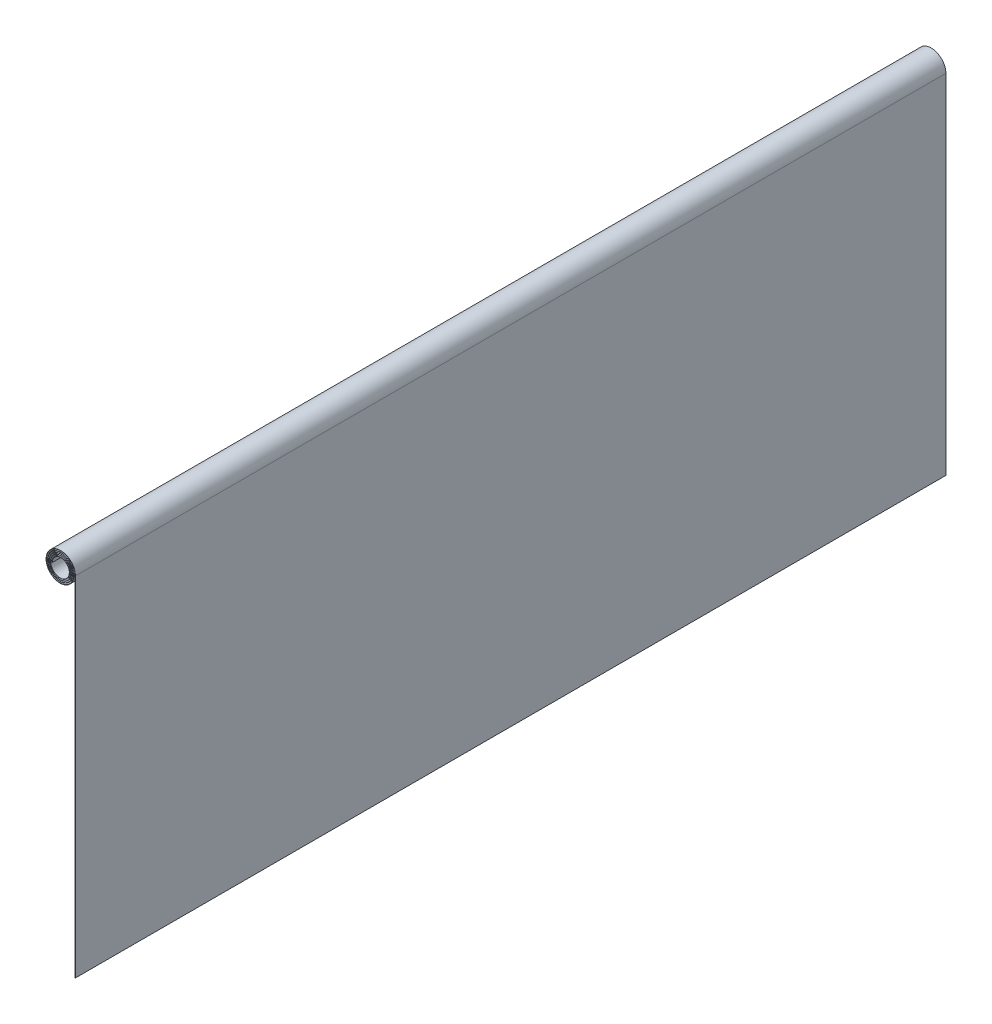
ISO-10303-21;
HEADER;
FILE_DESCRIPTION(('STEP AP214'),'2;1');
FILE_NAME('part.step','',(''),(''),'','','');
FILE_SCHEMA(('AUTOMOTIVE_DESIGN { 1 0 10303 214 1 1 1 1 }'));
ENDSEC;
DATA;
#1=APPLICATION_CONTEXT('core data for automotive mechanical design processes');
#2=APPLICATION_PROTOCOL_DEFINITION('international standard','automotive_design',2000,#1);
#3=PRODUCT_CONTEXT('',#1,'mechanical');
#4=PRODUCT('Part','Part','',(#3));
#5=PRODUCT_RELATED_PRODUCT_CATEGORY('part','',(#4));
#6=PRODUCT_DEFINITION_FORMATION('','',#4);
#7=PRODUCT_DEFINITION_CONTEXT('part definition',#1,'design');
#8=PRODUCT_DEFINITION('design','',#6,#7);
#9=PRODUCT_DEFINITION_SHAPE('','',#8);
#10=(LENGTH_UNIT() NAMED_UNIT(*) SI_UNIT(.MILLI.,.METRE.));
#11=(NAMED_UNIT(*) PLANE_ANGLE_UNIT() SI_UNIT($,.RADIAN.));
#12=(NAMED_UNIT(*) SI_UNIT($,.STERADIAN.) SOLID_ANGLE_UNIT());
#13=UNCERTAINTY_MEASURE_WITH_UNIT(LENGTH_MEASURE(1.E-05),#10,'distance_accuracy_value','');
#14=(GEOMETRIC_REPRESENTATION_CONTEXT(3) GLOBAL_UNCERTAINTY_ASSIGNED_CONTEXT((#13)) GLOBAL_UNIT_ASSIGNED_CONTEXT((#10,
#11,#12)) REPRESENTATION_CONTEXT('',''));
#15=CARTESIAN_POINT('',(0.,0.,0.));
#16=DIRECTION('',(0.,0.,1.));
#17=DIRECTION('',(1.,0.,0.));
#18=AXIS2_PLACEMENT_3D('',#15,#16,#17);
#19=CARTESIAN_POINT('',(0.,0.,0.));
#20=DIRECTION('',(0.,0.,1.));
#21=DIRECTION('',(1.,0.,0.));
#22=AXIS2_PLACEMENT_3D('',#19,#20,#21);
#23=CYLINDRICAL_SURFACE('',#22,14.7499999999999);
#24=DIRECTION('',(0.,0.,1.));
#25=VECTOR('',#24,1.);
#26=CARTESIAN_POINT('',(14.7500000000001,1.06661353137454E-12,749.999999999997));
#27=LINE('',#26,#25);
#28=CARTESIAN_POINT('',(14.7499999999998,1.06661353137453E-12,-750.000000000003));
#29=VERTEX_POINT('',#28);
#30=CARTESIAN_POINT('',(14.7500000000001,1.06661353137454E-12,749.999999999997));
#31=VERTEX_POINT('',#30);
#32=EDGE_CURVE('E337',#29,#31,#27,.T.);
#33=ORIENTED_EDGE('',*,*,#32,.T.);
#34=CARTESIAN_POINT('',(0.,0.,749.999999999997));
#35=DIRECTION('',(0.,0.,1.));
#36=DIRECTION('',(1.,0.,0.));
#37=AXIS2_PLACEMENT_3D('',#34,#35,#36);
#38=CIRCLE('',#37,14.7500000000001);
#39=CARTESIAN_POINT('',(-14.7500000000001,-1.0648071773458E-12,749.999999999997));
#40=VERTEX_POINT('',#39);
#41=EDGE_CURVE('E362',#31,#40,#38,.T.);
#42=ORIENTED_EDGE('',*,*,#41,.T.);
#43=DIRECTION('',(0.,0.,1.));
#44=VECTOR('',#43,1.);
#45=CARTESIAN_POINT('',(-14.7500000000001,-1.0648071773458E-12,749.999999999997));
#46=LINE('',#45,#44);
#47=CARTESIAN_POINT('',(-14.7499999999998,-1.06480717734578E-12,-750.000000000003));
#48=VERTEX_POINT('',#47);
#49=EDGE_CURVE('E57',#48,#40,#46,.T.);
#50=ORIENTED_EDGE('',*,*,#49,.F.);
#51=CARTESIAN_POINT('',(0.,0.,-750.000000000003));
#52=DIRECTION('',(0.,0.,1.));
#53=DIRECTION('',(1.,0.,0.));
#54=AXIS2_PLACEMENT_3D('',#51,#52,#53);
#55=CIRCLE('',#54,14.7499999999998);
#56=EDGE_CURVE('E42',#29,#48,#55,.T.);
#57=ORIENTED_EDGE('',*,*,#56,.F.);
#58=EDGE_LOOP('',(#33,#42,#50,#57));
#59=FACE_BOUND('',#58,.T.);
#60=ADVANCED_FACE('F35',(#59),#23,.F.);
#61=CARTESIAN_POINT('',(0.,0.,0.));
#62=DIRECTION('',(0.,0.,1.));
#63=DIRECTION('',(1.,0.,0.));
#64=AXIS2_PLACEMENT_3D('',#61,#62,#63);
#65=CYLINDRICAL_SURFACE('',#64,15.2499999999999);
#66=DIRECTION('',(0.,0.,-1.));
#67=VECTOR('',#66,1.);
#68=CARTESIAN_POINT('',(15.2500000000001,1.09454538208529E-12,749.999999999997));
#69=LINE('',#68,#67);
#70=CARTESIAN_POINT('',(15.2500000000001,1.09454538208529E-12,749.999999999997));
#71=VERTEX_POINT('',#70);
#72=CARTESIAN_POINT('',(15.2499999999998,1.09454538208527E-12,-750.000000000003));
#73=VERTEX_POINT('',#72);
#74=EDGE_CURVE('E334',#71,#73,#69,.T.);
#75=ORIENTED_EDGE('',*,*,#74,.T.);
#76=CARTESIAN_POINT('',(0.,0.,-750.000000000003));
#77=DIRECTION('',(0.,0.,1.));
#78=DIRECTION('',(1.,0.,0.));
#79=AXIS2_PLACEMENT_3D('',#76,#77,#78);
#80=CIRCLE('',#79,15.2499999999998);
#81=CARTESIAN_POINT('',(-15.2499999999998,-1.09267779571657E-12,-750.000000000003));
#82=VERTEX_POINT('',#81);
#83=EDGE_CURVE('E11',#73,#82,#80,.T.);
#84=ORIENTED_EDGE('',*,*,#83,.T.);
#85=DIRECTION('',(0.,0.,-1.));
#86=VECTOR('',#85,1.);
#87=CARTESIAN_POINT('',(-15.2500000000001,-1.09267779571659E-12,749.999999999997));
#88=LINE('',#87,#86);
#89=CARTESIAN_POINT('',(-15.2500000000001,-1.09267779571659E-12,749.999999999997));
#90=VERTEX_POINT('',#89);
#91=EDGE_CURVE('E352',#90,#82,#88,.T.);
#92=ORIENTED_EDGE('',*,*,#91,.F.);
#93=CARTESIAN_POINT('',(0.,0.,749.999999999997));
#94=DIRECTION('',(0.,0.,1.));
#95=DIRECTION('',(1.,0.,0.));
#96=AXIS2_PLACEMENT_3D('',#93,#94,#95);
#97=CIRCLE('',#96,15.2500000000001);
#98=EDGE_CURVE('E359',#71,#90,#97,.T.);
#99=ORIENTED_EDGE('',*,*,#98,.F.);
#100=EDGE_LOOP('',(#75,#84,#92,#99));
#101=FACE_BOUND('',#100,.T.);
#102=ADVANCED_FACE('F372',(#101),#65,.T.);
#103=CARTESIAN_POINT('',(-1.25,0.,0.));
#104=DIRECTION('',(0.,0.,1.));
#105=DIRECTION('',(1.,0.,0.));
#106=AXIS2_PLACEMENT_3D('',#103,#104,#105);
#107=CYLINDRICAL_SURFACE('',#106,15.9999999999999);
#108=DIRECTION('',(0.,0.,1.));
#109=VECTOR('',#108,1.);
#110=CARTESIAN_POINT('',(-17.2500000000001,-8.41199290809946E-13,749.999999999997));
#111=LINE('',#110,#109);
#112=CARTESIAN_POINT('',(-17.2499999999998,-8.41199290809934E-13,-750.000000000003));
#113=VERTEX_POINT('',#112);
#114=CARTESIAN_POINT('',(-17.2500000000001,-8.41199290809946E-13,749.999999999997));
#115=VERTEX_POINT('',#114);
#116=EDGE_CURVE('E319',#113,#115,#111,.T.);
#117=ORIENTED_EDGE('',*,*,#116,.T.);
#118=CARTESIAN_POINT('',(-1.25,0.,749.999999999997));
#119=DIRECTION('',(0.,0.,1.));
#120=DIRECTION('',(1.,0.,0.));
#121=AXIS2_PLACEMENT_3D('',#118,#119,#120);
#122=CIRCLE('',#121,16.0000000000001);
#123=EDGE_CURVE('E343',#115,#31,#122,.T.);
#124=ORIENTED_EDGE('',*,*,#123,.T.);
#125=ORIENTED_EDGE('',*,*,#32,.F.);
#126=CARTESIAN_POINT('',(-1.25,0.,-750.000000000003));
#127=DIRECTION('',(0.,0.,1.));
#128=DIRECTION('',(1.,0.,0.));
#129=AXIS2_PLACEMENT_3D('',#126,#127,#128);
#130=CIRCLE('',#129,15.9999999999998);
#131=EDGE_CURVE('E346',#113,#29,#130,.T.);
#132=ORIENTED_EDGE('',*,*,#131,.F.);
#133=EDGE_LOOP('',(#117,#124,#125,#132));
#134=FACE_BOUND('',#133,.T.);
#135=ADVANCED_FACE('F365',(#134),#107,.F.);
#136=CARTESIAN_POINT('',(-1.25,0.,0.));
#137=DIRECTION('',(0.,0.,1.));
#138=DIRECTION('',(1.,0.,0.));
#139=AXIS2_PLACEMENT_3D('',#136,#137,#138);
#140=CYLINDRICAL_SURFACE('',#139,16.4999999999999);
#141=DIRECTION('',(0.,0.,-1.));
#142=VECTOR('',#141,1.);
#143=CARTESIAN_POINT('',(-17.7500000000001,-8.62086946503047E-13,749.999999999997));
#144=LINE('',#143,#142);
#145=CARTESIAN_POINT('',(-17.7500000000001,-8.62086946503047E-13,749.999999999997));
#146=VERTEX_POINT('',#145);
#147=CARTESIAN_POINT('',(-17.7499999999998,-8.62086946503035E-13,-750.000000000003));
#148=VERTEX_POINT('',#147);
#149=EDGE_CURVE('E316',#146,#148,#144,.T.);
#150=ORIENTED_EDGE('',*,*,#149,.T.);
#151=CARTESIAN_POINT('',(-1.25,0.,-750.000000000003));
#152=DIRECTION('',(0.,0.,1.));
#153=DIRECTION('',(1.,0.,0.));
#154=AXIS2_PLACEMENT_3D('',#151,#152,#153);
#155=CIRCLE('',#154,16.4999999999998);
#156=EDGE_CURVE('E349',#148,#73,#155,.T.);
#157=ORIENTED_EDGE('',*,*,#156,.T.);
#158=ORIENTED_EDGE('',*,*,#74,.F.);
#159=CARTESIAN_POINT('',(-1.25,0.,749.999999999997));
#160=DIRECTION('',(0.,0.,1.));
#161=DIRECTION('',(1.,0.,0.));
#162=AXIS2_PLACEMENT_3D('',#159,#160,#161);
#163=CIRCLE('',#162,16.5000000000001);
#164=EDGE_CURVE('E340',#146,#71,#163,.T.);
#165=ORIENTED_EDGE('',*,*,#164,.F.);
#166=EDGE_LOOP('',(#150,#157,#158,#165));
#167=FACE_BOUND('',#166,.T.);
#168=ADVANCED_FACE('F376',(#167),#140,.T.);
#169=CARTESIAN_POINT('',(0.,0.,0.));
#170=DIRECTION('',(0.,0.,1.));
#171=DIRECTION('',(1.,0.,0.));
#172=AXIS2_PLACEMENT_3D('',#169,#170,#171);
#173=CYLINDRICAL_SURFACE('',#172,17.2499999999999);
#174=DIRECTION('',(0.,0.,1.));
#175=VECTOR('',#174,1.);
#176=CARTESIAN_POINT('',(17.2500000000001,5.75192946091498E-13,749.999999999997));
#177=LINE('',#176,#175);
#178=CARTESIAN_POINT('',(17.2499999999998,5.75192946091491E-13,-750.000000000003));
#179=VERTEX_POINT('',#178);
#180=CARTESIAN_POINT('',(17.2500000000001,5.75192946091498E-13,749.999999999997));
#181=VERTEX_POINT('',#180);
#182=EDGE_CURVE('E301',#179,#181,#177,.T.);
#183=ORIENTED_EDGE('',*,*,#182,.T.);
#184=CARTESIAN_POINT('',(0.,0.,749.999999999997));
#185=DIRECTION('',(0.,0.,1.));
#186=DIRECTION('',(1.,0.,0.));
#187=AXIS2_PLACEMENT_3D('',#184,#185,#186);
#188=CIRCLE('',#187,17.2500000000001);
#189=EDGE_CURVE('E325',#181,#115,#188,.T.);
#190=ORIENTED_EDGE('',*,*,#189,.T.);
#191=ORIENTED_EDGE('',*,*,#116,.F.);
#192=CARTESIAN_POINT('',(0.,0.,-750.000000000003));
#193=DIRECTION('',(0.,0.,1.));
#194=DIRECTION('',(1.,0.,0.));
#195=AXIS2_PLACEMENT_3D('',#192,#193,#194);
#196=CIRCLE('',#195,17.2499999999998);
#197=EDGE_CURVE('E328',#179,#113,#196,.T.);
#198=ORIENTED_EDGE('',*,*,#197,.F.);
#199=EDGE_LOOP('',(#183,#190,#191,#198));
#200=FACE_BOUND('',#199,.T.);
#201=ADVANCED_FACE('F432',(#200),#173,.F.);
#202=CARTESIAN_POINT('',(0.,0.,0.));
#203=DIRECTION('',(0.,0.,1.));
#204=DIRECTION('',(1.,0.,0.));
#205=AXIS2_PLACEMENT_3D('',#202,#203,#204);
#206=CYLINDRICAL_SURFACE('',#205,17.7499999999999);
#207=DIRECTION('',(0.,0.,-1.));
#208=VECTOR('',#207,1.);
#209=CARTESIAN_POINT('',(17.7500000000001,5.88370272952181E-13,749.999999999997));
#210=LINE('',#209,#208);
#211=CARTESIAN_POINT('',(17.7500000000001,5.88370272952181E-13,749.999999999997));
#212=VERTEX_POINT('',#211);
#213=CARTESIAN_POINT('',(17.7499999999998,5.88370272952174E-13,-750.000000000003));
#214=VERTEX_POINT('',#213);
#215=EDGE_CURVE('E298',#212,#214,#210,.T.);
#216=ORIENTED_EDGE('',*,*,#215,.T.);
#217=CARTESIAN_POINT('',(0.,0.,-750.000000000003));
#218=DIRECTION('',(0.,0.,1.));
#219=DIRECTION('',(1.,0.,0.));
#220=AXIS2_PLACEMENT_3D('',#217,#218,#219);
#221=CIRCLE('',#220,17.7499999999998);
#222=EDGE_CURVE('E331',#214,#148,#221,.T.);
#223=ORIENTED_EDGE('',*,*,#222,.T.);
#224=ORIENTED_EDGE('',*,*,#149,.F.);
#225=CARTESIAN_POINT('',(0.,0.,749.999999999997));
#226=DIRECTION('',(0.,0.,1.));
#227=DIRECTION('',(1.,0.,0.));
#228=AXIS2_PLACEMENT_3D('',#225,#226,#227);
#229=CIRCLE('',#228,17.7500000000001);
#230=EDGE_CURVE('E322',#212,#146,#229,.T.);
#231=ORIENTED_EDGE('',*,*,#230,.F.);
#232=EDGE_LOOP('',(#216,#223,#224,#231));
#233=FACE_BOUND('',#232,.T.);
#234=ADVANCED_FACE('F378',(#233),#206,.T.);
#235=CARTESIAN_POINT('',(-1.25,0.,0.));
#236=DIRECTION('',(0.,0.,1.));
#237=DIRECTION('',(1.,0.,0.));
#238=AXIS2_PLACEMENT_3D('',#235,#236,#237);
#239=CYLINDRICAL_SURFACE('',#238,18.4999999999999);
#240=DIRECTION('',(0.,0.,1.));
#241=VECTOR('',#240,1.);
#242=CARTESIAN_POINT('',(-19.7500000000001,-5.98636046864646E-13,749.999999999997));
#243=LINE('',#242,#241);
#244=CARTESIAN_POINT('',(-19.7499999999998,-5.98636046864638E-13,-750.000000000003));
#245=VERTEX_POINT('',#244);
#246=CARTESIAN_POINT('',(-19.7500000000001,-5.98636046864646E-13,749.999999999997));
#247=VERTEX_POINT('',#246);
#248=EDGE_CURVE('E283',#245,#247,#243,.T.);
#249=ORIENTED_EDGE('',*,*,#248,.T.);
#250=CARTESIAN_POINT('',(-1.25,0.,749.999999999997));
#251=DIRECTION('',(0.,0.,1.));
#252=DIRECTION('',(1.,0.,0.));
#253=AXIS2_PLACEMENT_3D('',#250,#251,#252);
#254=CIRCLE('',#253,18.5000000000001);
#255=EDGE_CURVE('E307',#247,#181,#254,.T.);
#256=ORIENTED_EDGE('',*,*,#255,.T.);
#257=ORIENTED_EDGE('',*,*,#182,.F.);
#258=CARTESIAN_POINT('',(-1.25,0.,-750.000000000003));
#259=DIRECTION('',(0.,0.,1.));
#260=DIRECTION('',(1.,0.,0.));
#261=AXIS2_PLACEMENT_3D('',#258,#259,#260);
#262=CIRCLE('',#261,18.4999999999998);
#263=EDGE_CURVE('E310',#245,#179,#262,.T.);
#264=ORIENTED_EDGE('',*,*,#263,.F.);
#265=EDGE_LOOP('',(#249,#256,#257,#264));
#266=FACE_BOUND('',#265,.T.);
#267=ADVANCED_FACE('F438',(#266),#239,.F.);
#268=CARTESIAN_POINT('',(-1.25,0.,0.));
#269=DIRECTION('',(0.,0.,1.));
#270=DIRECTION('',(1.,0.,0.));
#271=AXIS2_PLACEMENT_3D('',#268,#269,#270);
#272=CYLINDRICAL_SURFACE('',#271,18.9999999999999);
#273=DIRECTION('',(0.,0.,-1.));
#274=VECTOR('',#273,1.);
#275=CARTESIAN_POINT('',(-20.2500000000001,-6.12540739880061E-13,749.999999999997));
#276=LINE('',#275,#274);
#277=CARTESIAN_POINT('',(-20.2500000000001,-6.12540739880061E-13,749.999999999997));
#278=VERTEX_POINT('',#277);
#279=CARTESIAN_POINT('',(-20.2499999999998,-6.12540739880053E-13,-750.000000000003));
#280=VERTEX_POINT('',#279);
#281=EDGE_CURVE('E280',#278,#280,#276,.T.);
#282=ORIENTED_EDGE('',*,*,#281,.T.);
#283=CARTESIAN_POINT('',(-1.25,0.,-750.000000000003));
#284=DIRECTION('',(0.,0.,1.));
#285=DIRECTION('',(1.,0.,0.));
#286=AXIS2_PLACEMENT_3D('',#283,#284,#285);
#287=CIRCLE('',#286,18.9999999999998);
#288=EDGE_CURVE('E313',#280,#214,#287,.T.);
#289=ORIENTED_EDGE('',*,*,#288,.T.);
#290=ORIENTED_EDGE('',*,*,#215,.F.);
#291=CARTESIAN_POINT('',(-1.25,0.,749.999999999997));
#292=DIRECTION('',(0.,0.,1.));
#293=DIRECTION('',(1.,0.,0.));
#294=AXIS2_PLACEMENT_3D('',#291,#292,#293);
#295=CIRCLE('',#294,19.0000000000001);
#296=EDGE_CURVE('E304',#278,#212,#295,.T.);
#297=ORIENTED_EDGE('',*,*,#296,.F.);
#298=EDGE_LOOP('',(#282,#289,#290,#297));
#299=FACE_BOUND('',#298,.T.);
#300=ADVANCED_FACE('F381',(#299),#272,.T.);
#301=CARTESIAN_POINT('',(0.,0.,0.));
#302=DIRECTION('',(0.,0.,1.));
#303=DIRECTION('',(1.,0.,0.));
#304=AXIS2_PLACEMENT_3D('',#301,#302,#303);
#305=CYLINDRICAL_SURFACE('',#304,19.7499999999999);
#306=DIRECTION('',(0.,0.,1.));
#307=VECTOR('',#306,1.);
#308=CARTESIAN_POINT('',(19.7500000000001,3.11619581773182E-13,749.999999999997));
#309=LINE('',#308,#307);
#310=CARTESIAN_POINT('',(19.7499999999998,3.11619581773179E-13,-750.000000000003));
#311=VERTEX_POINT('',#310);
#312=CARTESIAN_POINT('',(19.7500000000001,3.11619581773182E-13,749.999999999997));
#313=VERTEX_POINT('',#312);
#314=EDGE_CURVE('E265',#311,#313,#309,.T.);
#315=ORIENTED_EDGE('',*,*,#314,.T.);
#316=CARTESIAN_POINT('',(0.,0.,749.999999999997));
#317=DIRECTION('',(0.,0.,1.));
#318=DIRECTION('',(1.,0.,0.));
#319=AXIS2_PLACEMENT_3D('',#316,#317,#318);
#320=CIRCLE('',#319,19.7500000000001);
#321=EDGE_CURVE('E289',#313,#247,#320,.T.);
#322=ORIENTED_EDGE('',*,*,#321,.T.);
#323=ORIENTED_EDGE('',*,*,#248,.F.);
#324=CARTESIAN_POINT('',(0.,0.,-750.000000000003));
#325=DIRECTION('',(0.,0.,1.));
#326=DIRECTION('',(1.,0.,0.));
#327=AXIS2_PLACEMENT_3D('',#324,#325,#326);
#328=CIRCLE('',#327,19.7499999999998);
#329=EDGE_CURVE('E292',#311,#245,#328,.T.);
#330=ORIENTED_EDGE('',*,*,#329,.F.);
#331=EDGE_LOOP('',(#315,#322,#323,#330));
#332=FACE_BOUND('',#331,.T.);
#333=ADVANCED_FACE('F444',(#332),#305,.F.);
#334=CARTESIAN_POINT('',(0.,0.,0.));
#335=DIRECTION('',(0.,0.,1.));
#336=DIRECTION('',(1.,0.,0.));
#337=AXIS2_PLACEMENT_3D('',#334,#335,#336);
#338=CYLINDRICAL_SURFACE('',#337,20.2499999999999);
#339=DIRECTION('',(0.,0.,-1.));
#340=VECTOR('',#339,1.);
#341=CARTESIAN_POINT('',(20.2500000000001,3.18258035166029E-13,749.999999999997));
#342=LINE('',#341,#340);
#343=CARTESIAN_POINT('',(20.2500000000001,3.18258035166029E-13,749.999999999997));
#344=VERTEX_POINT('',#343);
#345=CARTESIAN_POINT('',(20.2499999999998,3.18258035166025E-13,-750.000000000003));
#346=VERTEX_POINT('',#345);
#347=EDGE_CURVE('E262',#344,#346,#342,.T.);
#348=ORIENTED_EDGE('',*,*,#347,.T.);
#349=CARTESIAN_POINT('',(0.,0.,-750.000000000003));
#350=DIRECTION('',(0.,0.,1.));
#351=DIRECTION('',(1.,0.,0.));
#352=AXIS2_PLACEMENT_3D('',#349,#350,#351);
#353=CIRCLE('',#352,20.2499999999998);
#354=EDGE_CURVE('E295',#346,#280,#353,.T.);
#355=ORIENTED_EDGE('',*,*,#354,.T.);
#356=ORIENTED_EDGE('',*,*,#281,.F.);
#357=CARTESIAN_POINT('',(0.,0.,749.999999999997));
#358=DIRECTION('',(0.,0.,1.));
#359=DIRECTION('',(1.,0.,0.));
#360=AXIS2_PLACEMENT_3D('',#357,#358,#359);
#361=CIRCLE('',#360,20.2500000000001);
#362=EDGE_CURVE('E286',#344,#278,#361,.T.);
#363=ORIENTED_EDGE('',*,*,#362,.F.);
#364=EDGE_LOOP('',(#348,#355,#356,#363));
#365=FACE_BOUND('',#364,.T.);
#366=ADVANCED_FACE('F385',(#365),#338,.T.);
#367=CARTESIAN_POINT('',(-1.25,0.,0.));
#368=DIRECTION('',(0.,0.,1.));
#369=DIRECTION('',(1.,0.,0.));
#370=AXIS2_PLACEMENT_3D('',#367,#368,#369);
#371=CYLINDRICAL_SURFACE('',#370,20.9999999999999);
#372=DIRECTION('',(0.,0.,1.));
#373=VECTOR('',#372,1.);
#374=CARTESIAN_POINT('',(-22.2500000000001,-3.23517213458243E-13,749.999999999997));
#375=LINE('',#374,#373);
#376=CARTESIAN_POINT('',(-22.2499999999998,-3.23517213458239E-13,-750.000000000003));
#377=VERTEX_POINT('',#376);
#378=CARTESIAN_POINT('',(-22.2500000000001,-3.23517213458243E-13,749.999999999997));
#379=VERTEX_POINT('',#378);
#380=EDGE_CURVE('E247',#377,#379,#375,.T.);
#381=ORIENTED_EDGE('',*,*,#380,.T.);
#382=CARTESIAN_POINT('',(-1.25,0.,749.999999999997));
#383=DIRECTION('',(0.,0.,1.));
#384=DIRECTION('',(1.,0.,0.));
#385=AXIS2_PLACEMENT_3D('',#382,#383,#384);
#386=CIRCLE('',#385,21.0000000000001);
#387=EDGE_CURVE('E271',#379,#313,#386,.T.);
#388=ORIENTED_EDGE('',*,*,#387,.T.);
#389=ORIENTED_EDGE('',*,*,#314,.F.);
#390=CARTESIAN_POINT('',(-1.25,0.,-750.000000000003));
#391=DIRECTION('',(0.,0.,1.));
#392=DIRECTION('',(1.,0.,0.));
#393=AXIS2_PLACEMENT_3D('',#390,#391,#392);
#394=CIRCLE('',#393,20.9999999999998);
#395=EDGE_CURVE('E274',#377,#311,#394,.T.);
#396=ORIENTED_EDGE('',*,*,#395,.F.);
#397=EDGE_LOOP('',(#381,#388,#389,#396));
#398=FACE_BOUND('',#397,.T.);
#399=ADVANCED_FACE('F450',(#398),#371,.F.);
#400=CARTESIAN_POINT('',(-1.25,0.,0.));
#401=DIRECTION('',(0.,0.,1.));
#402=DIRECTION('',(1.,0.,0.));
#403=AXIS2_PLACEMENT_3D('',#400,#401,#402);
#404=CYLINDRICAL_SURFACE('',#403,21.4999999999999);
#405=DIRECTION('',(0.,0.,-1.));
#406=VECTOR('',#405,1.);
#407=CARTESIAN_POINT('',(-22.7500000000001,-3.30438943795972E-13,749.999999999997));
#408=LINE('',#407,#406);
#409=CARTESIAN_POINT('',(-22.7500000000001,-3.30438943795972E-13,749.999999999997));
#410=VERTEX_POINT('',#409);
#411=CARTESIAN_POINT('',(-22.7499999999998,-3.30438943795968E-13,-750.000000000003));
#412=VERTEX_POINT('',#411);
#413=EDGE_CURVE('E244',#410,#412,#408,.T.);
#414=ORIENTED_EDGE('',*,*,#413,.T.);
#415=CARTESIAN_POINT('',(-1.25,0.,-750.000000000003));
#416=DIRECTION('',(0.,0.,1.));
#417=DIRECTION('',(1.,0.,0.));
#418=AXIS2_PLACEMENT_3D('',#415,#416,#417);
#419=CIRCLE('',#418,21.4999999999998);
#420=EDGE_CURVE('E277',#412,#346,#419,.T.);
#421=ORIENTED_EDGE('',*,*,#420,.T.);
#422=ORIENTED_EDGE('',*,*,#347,.F.);
#423=CARTESIAN_POINT('',(-1.25,0.,749.999999999997));
#424=DIRECTION('',(0.,0.,1.));
#425=DIRECTION('',(1.,0.,0.));
#426=AXIS2_PLACEMENT_3D('',#423,#424,#425);
#427=CIRCLE('',#426,21.5000000000001);
#428=EDGE_CURVE('E268',#410,#344,#427,.T.);
#429=ORIENTED_EDGE('',*,*,#428,.F.);
#430=EDGE_LOOP('',(#414,#421,#422,#429));
#431=FACE_BOUND('',#430,.T.);
#432=ADVANCED_FACE('F387',(#431),#404,.T.);
#433=CARTESIAN_POINT('',(0.,0.,0.));
#434=DIRECTION('',(0.,0.,1.));
#435=DIRECTION('',(1.,0.,0.));
#436=AXIS2_PLACEMENT_3D('',#433,#434,#435);
#437=CYLINDRICAL_SURFACE('',#436,22.2499999999999);
#438=DIRECTION('',(0.,0.,1.));
#439=VECTOR('',#438,1.);
#440=CARTESIAN_POINT('',(22.2500000000001,3.55885007343838E-13,749.999999999997));
#441=LINE('',#440,#439);
#442=CARTESIAN_POINT('',(22.2499999999998,3.55885007343834E-13,-750.000000000003));
#443=VERTEX_POINT('',#442);
#444=CARTESIAN_POINT('',(22.2500000000001,3.55885007343838E-13,749.999999999997));
#445=VERTEX_POINT('',#444);
#446=EDGE_CURVE('E231',#443,#445,#441,.T.);
#447=ORIENTED_EDGE('',*,*,#446,.T.);
#448=CARTESIAN_POINT('',(0.,0.,749.999999999997));
#449=DIRECTION('',(0.,0.,1.));
#450=DIRECTION('',(1.,0.,0.));
#451=AXIS2_PLACEMENT_3D('',#448,#449,#450);
#452=CIRCLE('',#451,22.2500000000001);
#453=EDGE_CURVE('E253',#445,#379,#452,.T.);
#454=ORIENTED_EDGE('',*,*,#453,.T.);
#455=ORIENTED_EDGE('',*,*,#380,.F.);
#456=CARTESIAN_POINT('',(0.,0.,-750.000000000003));
#457=DIRECTION('',(0.,0.,1.));
#458=DIRECTION('',(1.,0.,0.));
#459=AXIS2_PLACEMENT_3D('',#456,#457,#458);
#460=CIRCLE('',#459,22.2499999999998);
#461=EDGE_CURVE('E256',#443,#377,#460,.T.);
#462=ORIENTED_EDGE('',*,*,#461,.F.);
#463=EDGE_LOOP('',(#447,#454,#455,#462));
#464=FACE_BOUND('',#463,.T.);
#465=ADVANCED_FACE('F456',(#464),#437,.F.);
#466=CARTESIAN_POINT('',(0.,0.,0.));
#467=DIRECTION('',(0.,0.,1.));
#468=DIRECTION('',(1.,0.,0.));
#469=AXIS2_PLACEMENT_3D('',#466,#467,#468);
#470=CYLINDRICAL_SURFACE('',#469,22.7499999999999);
#471=DIRECTION('',(0.,0.,-1.));
#472=VECTOR('',#471,1.);
#473=CARTESIAN_POINT('',(22.7500000000001,3.63534103836299E-13,749.999999999997));
#474=LINE('',#473,#472);
#475=CARTESIAN_POINT('',(22.7500000000001,3.63534103836299E-13,749.999999999997));
#476=VERTEX_POINT('',#475);
#477=CARTESIAN_POINT('',(22.7499999999998,3.63534103836295E-13,-750.000000000003));
#478=VERTEX_POINT('',#477);
#479=EDGE_CURVE('E194',#476,#478,#474,.T.);
#480=ORIENTED_EDGE('',*,*,#479,.T.);
#481=CARTESIAN_POINT('',(0.,0.,-750.000000000003));
#482=DIRECTION('',(0.,0.,1.));
#483=DIRECTION('',(1.,0.,0.));
#484=AXIS2_PLACEMENT_3D('',#481,#482,#483);
#485=CIRCLE('',#484,22.7499999999998);
#486=EDGE_CURVE('E259',#478,#412,#485,.T.);
#487=ORIENTED_EDGE('',*,*,#486,.T.);
#488=ORIENTED_EDGE('',*,*,#413,.F.);
#489=CARTESIAN_POINT('',(0.,0.,749.999999999997));
#490=DIRECTION('',(0.,0.,1.));
#491=DIRECTION('',(1.,0.,0.));
#492=AXIS2_PLACEMENT_3D('',#489,#490,#491);
#493=CIRCLE('',#492,22.7500000000001);
#494=EDGE_CURVE('E250',#476,#410,#493,.T.);
#495=ORIENTED_EDGE('',*,*,#494,.F.);
#496=EDGE_LOOP('',(#480,#487,#488,#495));
#497=FACE_BOUND('',#496,.T.);
#498=ADVANCED_FACE('F390',(#497),#470,.T.);
#499=CARTESIAN_POINT('',(-1.25,0.,0.));
#500=DIRECTION('',(0.,0.,1.));
#501=DIRECTION('',(1.,0.,0.));
#502=AXIS2_PLACEMENT_3D('',#499,#500,#501);
#503=CYLINDRICAL_SURFACE('',#502,23.4999999999999);
#504=DIRECTION('',(0.,0.,1.));
#505=VECTOR('',#504,1.);
#506=CARTESIAN_POINT('',(-24.7500000000001,0.,749.999999999997));
#507=LINE('',#506,#505);
#508=CARTESIAN_POINT('',(-24.7499999999998,0.,-750.000000000003));
#509=VERTEX_POINT('',#508);
#510=CARTESIAN_POINT('',(-24.7500000000001,0.,749.999999999997));
#511=VERTEX_POINT('',#510);
#512=EDGE_CURVE('E214',#509,#511,#507,.T.);
#513=ORIENTED_EDGE('',*,*,#512,.T.);
#514=CARTESIAN_POINT('',(-1.25,0.,749.999999999997));
#515=DIRECTION('',(0.,0.,1.));
#516=DIRECTION('',(1.,0.,0.));
#517=AXIS2_PLACEMENT_3D('',#514,#515,#516);
#518=CIRCLE('',#517,23.5000000000001);
#519=EDGE_CURVE('E237',#511,#445,#518,.T.);
#520=ORIENTED_EDGE('',*,*,#519,.T.);
#521=ORIENTED_EDGE('',*,*,#446,.F.);
#522=CARTESIAN_POINT('',(-1.25,0.,-750.000000000003));
#523=DIRECTION('',(0.,0.,1.));
#524=DIRECTION('',(1.,0.,0.));
#525=AXIS2_PLACEMENT_3D('',#522,#523,#524);
#526=CIRCLE('',#525,23.4999999999998);
#527=EDGE_CURVE('E240',#509,#443,#526,.T.);
#528=ORIENTED_EDGE('',*,*,#527,.F.);
#529=EDGE_LOOP('',(#513,#520,#521,#528));
#530=FACE_BOUND('',#529,.T.);
#531=ADVANCED_FACE('F462',(#530),#503,.F.);
#532=CARTESIAN_POINT('',(-1.25,0.,0.));
#533=DIRECTION('',(0.,0.,1.));
#534=DIRECTION('',(1.,0.,0.));
#535=AXIS2_PLACEMENT_3D('',#532,#533,#534);
#536=CYLINDRICAL_SURFACE('',#535,23.9999999999999);
#537=DIRECTION('',(0.,0.,-1.));
#538=VECTOR('',#537,1.);
#539=CARTESIAN_POINT('',(-25.2500000000001,0.,749.999999999997));
#540=LINE('',#539,#538);
#541=CARTESIAN_POINT('',(-25.2500000000001,0.,749.999999999997));
#542=VERTEX_POINT('',#541);
#543=CARTESIAN_POINT('',(-25.2499999999998,0.,-750.000000000003));
#544=VERTEX_POINT('',#543);
#545=EDGE_CURVE('E211',#542,#544,#540,.T.);
#546=ORIENTED_EDGE('',*,*,#545,.T.);
#547=CARTESIAN_POINT('',(-1.25,0.,-750.000000000003));
#548=DIRECTION('',(0.,0.,1.));
#549=DIRECTION('',(1.,0.,0.));
#550=AXIS2_PLACEMENT_3D('',#547,#548,#549);
#551=CIRCLE('',#550,23.9999999999998);
#552=EDGE_CURVE('E190',#544,#478,#551,.T.);
#553=ORIENTED_EDGE('',*,*,#552,.T.);
#554=ORIENTED_EDGE('',*,*,#479,.F.);
#555=CARTESIAN_POINT('',(-1.25,0.,749.999999999997));
#556=DIRECTION('',(0.,0.,1.));
#557=DIRECTION('',(1.,0.,0.));
#558=AXIS2_PLACEMENT_3D('',#555,#556,#557);
#559=CIRCLE('',#558,24.0000000000001);
#560=EDGE_CURVE('E234',#542,#476,#559,.T.);
#561=ORIENTED_EDGE('',*,*,#560,.F.);
#562=EDGE_LOOP('',(#546,#553,#554,#561));
#563=FACE_BOUND('',#562,.T.);
#564=ADVANCED_FACE('F393',(#563),#536,.T.);
#565=CARTESIAN_POINT('',(0.,0.,0.));
#566=DIRECTION('',(0.,0.,1.));
#567=DIRECTION('',(1.,0.,0.));
#568=AXIS2_PLACEMENT_3D('',#565,#566,#567);
#569=CYLINDRICAL_SURFACE('',#568,24.7499999999999);
#570=DIRECTION('',(0.,0.,1.));
#571=VECTOR('',#570,1.);
#572=CARTESIAN_POINT('',(24.7500000000001,0.,749.999999999997));
#573=LINE('',#572,#571);
#574=CARTESIAN_POINT('',(24.7499999999998,0.,-750.000000000003));
#575=VERTEX_POINT('',#574);
#576=CARTESIAN_POINT('',(24.7500000000001,0.,749.999999999997));
#577=VERTEX_POINT('',#576);
#578=EDGE_CURVE('E205',#575,#577,#573,.T.);
#579=ORIENTED_EDGE('',*,*,#578,.T.);
#580=CARTESIAN_POINT('',(0.,0.,749.999999999997));
#581=DIRECTION('',(0.,0.,1.));
#582=DIRECTION('',(1.,0.,0.));
#583=AXIS2_PLACEMENT_3D('',#580,#581,#582);
#584=CIRCLE('',#583,24.7500000000001);
#585=EDGE_CURVE('E224',#577,#511,#584,.T.);
#586=ORIENTED_EDGE('',*,*,#585,.T.);
#587=ORIENTED_EDGE('',*,*,#512,.F.);
#588=CARTESIAN_POINT('',(0.,0.,-750.000000000003));
#589=DIRECTION('',(0.,0.,1.));
#590=DIRECTION('',(1.,0.,0.));
#591=AXIS2_PLACEMENT_3D('',#588,#589,#590);
#592=CIRCLE('',#591,24.7499999999998);
#593=EDGE_CURVE('E195',#575,#509,#592,.T.);
#594=ORIENTED_EDGE('',*,*,#593,.F.);
#595=EDGE_LOOP('',(#579,#586,#587,#594));
#596=FACE_BOUND('',#595,.T.);
#597=ADVANCED_FACE('F468',(#596),#569,.F.);
#598=CARTESIAN_POINT('',(0.,0.,0.));
#599=DIRECTION('',(0.,0.,1.));
#600=DIRECTION('',(1.,0.,0.));
#601=AXIS2_PLACEMENT_3D('',#598,#599,#600);
#602=CYLINDRICAL_SURFACE('',#601,25.2499999999999);
#603=DIRECTION('',(0.,0.,-1.));
#604=VECTOR('',#603,1.);
#605=CARTESIAN_POINT('',(25.2500000000001,0.,749.999999999997));
#606=LINE('',#605,#604);
#607=CARTESIAN_POINT('',(25.2500000000001,0.,749.999999999997));
#608=VERTEX_POINT('',#607);
#609=CARTESIAN_POINT('',(25.2499999999998,0.,-750.000000000003));
#610=VERTEX_POINT('',#609);
#611=EDGE_CURVE('E198',#608,#610,#606,.T.);
#612=ORIENTED_EDGE('',*,*,#611,.T.);
#613=CARTESIAN_POINT('',(0.,0.,-750.000000000003));
#614=DIRECTION('',(0.,0.,1.));
#615=DIRECTION('',(1.,0.,0.));
#616=AXIS2_PLACEMENT_3D('',#613,#614,#615);
#617=CIRCLE('',#616,25.2499999999998);
#618=EDGE_CURVE('E183',#610,#544,#617,.T.);
#619=ORIENTED_EDGE('',*,*,#618,.T.);
#620=ORIENTED_EDGE('',*,*,#545,.F.);
#621=CARTESIAN_POINT('',(0.,0.,749.999999999997));
#622=DIRECTION('',(0.,0.,1.));
#623=DIRECTION('',(1.,0.,0.));
#624=AXIS2_PLACEMENT_3D('',#621,#622,#623);
#625=CIRCLE('',#624,25.2500000000001);
#626=EDGE_CURVE('E201',#608,#542,#625,.T.);
#627=ORIENTED_EDGE('',*,*,#626,.F.);
#628=EDGE_LOOP('',(#612,#619,#620,#627));
#629=FACE_BOUND('',#628,.T.);
#630=ADVANCED_FACE('F199',(#629),#602,.T.);
#631=CARTESIAN_POINT('',(25.2500000000001,0.,749.999999999997));
#632=DIRECTION('',(-1.,0.,0.));
#633=DIRECTION('',(0.,0.,1.));
#634=AXIS2_PLACEMENT_3D('',#631,#632,#633);
#635=PLANE('',#634);
#636=DIRECTION('',(0.,0.,-1.));
#637=VECTOR('',#636,1.);
#638=CARTESIAN_POINT('',(25.2500000000001,-600.,749.999999999997));
#639=LINE('',#638,#637);
#640=CARTESIAN_POINT('',(25.2500000000001,-600.,749.999999999997));
#641=VERTEX_POINT('',#640);
#642=CARTESIAN_POINT('',(25.2499999999999,-600.,-750.000000000003));
#643=VERTEX_POINT('',#642);
#644=EDGE_CURVE('E210',#641,#643,#639,.T.);
#645=ORIENTED_EDGE('',*,*,#644,.T.);
#646=DIRECTION('',(0.,-1.,0.));
#647=VECTOR('',#646,1.);
#648=CARTESIAN_POINT('',(25.2499999999998,0.,-750.000000000003));
#649=LINE('',#648,#647);
#650=EDGE_CURVE('E187',#610,#643,#649,.T.);
#651=ORIENTED_EDGE('',*,*,#650,.F.);
#652=ORIENTED_EDGE('',*,*,#611,.F.);
#653=DIRECTION('',(0.,-1.,0.));
#654=VECTOR('',#653,1.);
#655=CARTESIAN_POINT('',(25.2500000000001,0.,749.999999999997));
#656=LINE('',#655,#654);
#657=EDGE_CURVE('E394',#608,#641,#656,.T.);
#658=ORIENTED_EDGE('',*,*,#657,.T.);
#659=EDGE_LOOP('',(#645,#651,#652,#658));
#660=FACE_BOUND('',#659,.T.);
#661=ADVANCED_FACE('F208',(#660),#635,.F.);
#662=CARTESIAN_POINT('',(24.7499999999998,0.,-750.000000000003));
#663=DIRECTION('',(0.,0.,1.));
#664=DIRECTION('',(1.,0.,0.));
#665=AXIS2_PLACEMENT_3D('',#662,#663,#664);
#666=PLANE('',#665);
#667=DIRECTION('',(-1.,0.,0.));
#668=VECTOR('',#667,1.);
#669=CARTESIAN_POINT('',(24.7499999999999,-600.,-750.000000000003));
#670=LINE('',#669,#668);
#671=CARTESIAN_POINT('',(24.7499999999999,-600.,-750.000000000003));
#672=VERTEX_POINT('',#671);
#673=EDGE_CURVE('E404',#643,#672,#670,.T.);
#674=ORIENTED_EDGE('',*,*,#673,.T.);
#675=DIRECTION('',(0.,-1.,0.));
#676=VECTOR('',#675,1.);
#677=CARTESIAN_POINT('',(24.7499999999998,0.,-750.000000000003));
#678=LINE('',#677,#676);
#679=EDGE_CURVE('E212',#575,#672,#678,.T.);
#680=ORIENTED_EDGE('',*,*,#679,.F.);
#681=ORIENTED_EDGE('',*,*,#593,.T.);
#682=ORIENTED_EDGE('',*,*,#527,.T.);
#683=ORIENTED_EDGE('',*,*,#461,.T.);
#684=ORIENTED_EDGE('',*,*,#395,.T.);
#685=ORIENTED_EDGE('',*,*,#329,.T.);
#686=ORIENTED_EDGE('',*,*,#263,.T.);
#687=ORIENTED_EDGE('',*,*,#197,.T.);
#688=ORIENTED_EDGE('',*,*,#131,.T.);
#689=ORIENTED_EDGE('',*,*,#56,.T.);
#690=DIRECTION('',(1.,0.,0.));
#691=VECTOR('',#690,1.);
#692=CARTESIAN_POINT('',(-14.7499999999998,-1.06480717734578E-12,-750.000000000003));
#693=LINE('',#692,#691);
#694=EDGE_CURVE('E49',#82,#48,#693,.T.);
#695=ORIENTED_EDGE('',*,*,#694,.F.);
#696=ORIENTED_EDGE('',*,*,#83,.F.);
#697=ORIENTED_EDGE('',*,*,#156,.F.);
#698=ORIENTED_EDGE('',*,*,#222,.F.);
#699=ORIENTED_EDGE('',*,*,#288,.F.);
#700=ORIENTED_EDGE('',*,*,#354,.F.);
#701=ORIENTED_EDGE('',*,*,#420,.F.);
#702=ORIENTED_EDGE('',*,*,#486,.F.);
#703=ORIENTED_EDGE('',*,*,#552,.F.);
#704=ORIENTED_EDGE('',*,*,#618,.F.);
#705=ORIENTED_EDGE('',*,*,#650,.T.);
#706=EDGE_LOOP('',(#674,#680,#681,#682,#683,#684,#685,#686,#687,#688,#689,#695,#696,#697,#698,
#699,#700,#701,#702,#703,#704,#705));
#707=FACE_BOUND('',#706,.T.);
#708=ADVANCED_FACE('F185',(#707),#666,.F.);
#709=CARTESIAN_POINT('',(24.7500000000001,0.,749.999999999997));
#710=DIRECTION('',(1.,0.,0.));
#711=DIRECTION('',(0.,0.,-1.));
#712=AXIS2_PLACEMENT_3D('',#709,#710,#711);
#713=PLANE('',#712);
#714=DIRECTION('',(0.,0.,1.));
#715=VECTOR('',#714,1.);
#716=CARTESIAN_POINT('',(24.7500000000001,-600.,749.999999999997));
#717=LINE('',#716,#715);
#718=CARTESIAN_POINT('',(24.7500000000001,-600.,749.999999999997));
#719=VERTEX_POINT('',#718);
#720=EDGE_CURVE('E402',#672,#719,#717,.T.);
#721=ORIENTED_EDGE('',*,*,#720,.T.);
#722=DIRECTION('',(0.,-1.,0.));
#723=VECTOR('',#722,1.);
#724=CARTESIAN_POINT('',(24.7500000000001,0.,749.999999999997));
#725=LINE('',#724,#723);
#726=EDGE_CURVE('E217',#577,#719,#725,.T.);
#727=ORIENTED_EDGE('',*,*,#726,.F.);
#728=ORIENTED_EDGE('',*,*,#578,.F.);
#729=ORIENTED_EDGE('',*,*,#679,.T.);
#730=EDGE_LOOP('',(#721,#727,#728,#729));
#731=FACE_BOUND('',#730,.T.);
#732=ADVANCED_FACE('F411',(#731),#713,.F.);
#733=CARTESIAN_POINT('',(24.7500000000001,0.,749.999999999997));
#734=DIRECTION('',(0.,0.,-1.));
#735=DIRECTION('',(-1.,0.,0.));
#736=AXIS2_PLACEMENT_3D('',#733,#734,#735);
#737=PLANE('',#736);
#738=DIRECTION('',(1.,0.,0.));
#739=VECTOR('',#738,1.);
#740=CARTESIAN_POINT('',(24.7500000000001,-600.,749.999999999997));
#741=LINE('',#740,#739);
#742=EDGE_CURVE('E206',#719,#641,#741,.T.);
#743=ORIENTED_EDGE('',*,*,#742,.T.);
#744=ORIENTED_EDGE('',*,*,#657,.F.);
#745=ORIENTED_EDGE('',*,*,#626,.T.);
#746=ORIENTED_EDGE('',*,*,#560,.T.);
#747=ORIENTED_EDGE('',*,*,#494,.T.);
#748=ORIENTED_EDGE('',*,*,#428,.T.);
#749=ORIENTED_EDGE('',*,*,#362,.T.);
#750=ORIENTED_EDGE('',*,*,#296,.T.);
#751=ORIENTED_EDGE('',*,*,#230,.T.);
#752=ORIENTED_EDGE('',*,*,#164,.T.);
#753=ORIENTED_EDGE('',*,*,#98,.T.);
#754=DIRECTION('',(-1.,0.,0.));
#755=VECTOR('',#754,1.);
#756=CARTESIAN_POINT('',(-14.7500000000001,-1.0648071773458E-12,749.999999999997));
#757=LINE('',#756,#755);
#758=EDGE_CURVE('E354',#40,#90,#757,.T.);
#759=ORIENTED_EDGE('',*,*,#758,.F.);
#760=ORIENTED_EDGE('',*,*,#41,.F.);
#761=ORIENTED_EDGE('',*,*,#123,.F.);
#762=ORIENTED_EDGE('',*,*,#189,.F.);
#763=ORIENTED_EDGE('',*,*,#255,.F.);
#764=ORIENTED_EDGE('',*,*,#321,.F.);
#765=ORIENTED_EDGE('',*,*,#387,.F.);
#766=ORIENTED_EDGE('',*,*,#453,.F.);
#767=ORIENTED_EDGE('',*,*,#519,.F.);
#768=ORIENTED_EDGE('',*,*,#585,.F.);
#769=ORIENTED_EDGE('',*,*,#726,.T.);
#770=EDGE_LOOP('',(#743,#744,#745,#746,#747,#748,#749,#750,#751,#752,#753,#759,#760,#761,#762,
#763,#764,#765,#766,#767,#768,#769));
#771=FACE_BOUND('',#770,.T.);
#772=ADVANCED_FACE('F368',(#771),#737,.F.);
#773=CARTESIAN_POINT('',(10.0000000000001,3.14788432008199E-13,0.));
#774=DIRECTION('',(0.,1.,0.));
#775=DIRECTION('',(0.,0.,-1.));
#776=AXIS2_PLACEMENT_3D('',#773,#774,#775);
#777=PLANE('',#776);
#778=ORIENTED_EDGE('',*,*,#91,.T.);
#779=ORIENTED_EDGE('',*,*,#694,.T.);
#780=ORIENTED_EDGE('',*,*,#49,.T.);
#781=ORIENTED_EDGE('',*,*,#758,.T.);
#782=EDGE_LOOP('',(#778,#779,#780,#781));
#783=FACE_BOUND('',#782,.T.);
#784=ADVANCED_FACE('F370',(#783),#777,.F.);
#785=CARTESIAN_POINT('',(0.,-600.,0.));
#786=DIRECTION('',(0.,-1.,0.));
#787=DIRECTION('',(0.,0.,-1.));
#788=AXIS2_PLACEMENT_3D('',#785,#786,#787);
#789=PLANE('',#788);
#790=ORIENTED_EDGE('',*,*,#644,.F.);
#791=ORIENTED_EDGE('',*,*,#742,.F.);
#792=ORIENTED_EDGE('',*,*,#720,.F.);
#793=ORIENTED_EDGE('',*,*,#673,.F.);
#794=EDGE_LOOP('',(#790,#791,#792,#793));
#795=FACE_BOUND('',#794,.T.);
#796=ADVANCED_FACE('F413',(#795),#789,.T.);
#797=CLOSED_SHELL('',(#60,#102,#135,#168,#201,#234,#267,#300,#333,#366,#399,#432,#465,#498,#531,
#564,#597,#630,#661,#708,#732,#772,#784,#796));
#798=MANIFOLD_SOLID_BREP('B2',#797);
#799=ADVANCED_BREP_SHAPE_REPRESENTATION('',(#18,#798),#14);
#800=SHAPE_DEFINITION_REPRESENTATION(#9,#799);
ENDSEC;
END-ISO-10303-21;
